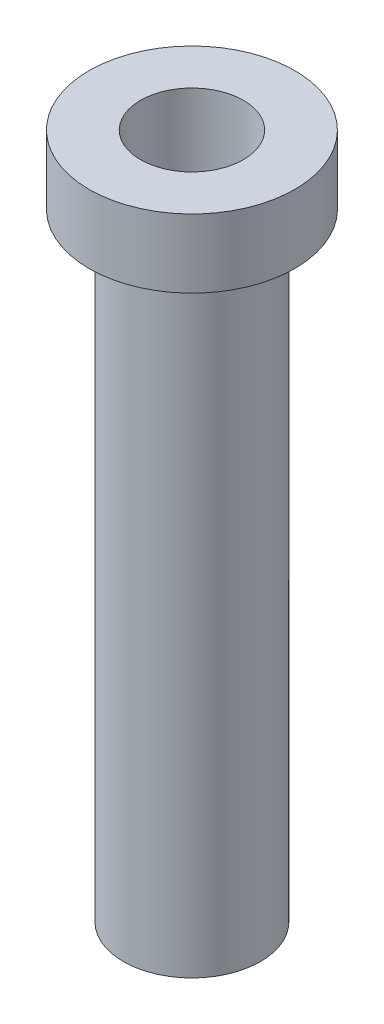
ISO-10303-21;
HEADER;
FILE_DESCRIPTION(('STEP AP214'),'2;1');
FILE_NAME('part.step','',(''),(''),'','','');
FILE_SCHEMA(('AUTOMOTIVE_DESIGN { 1 0 10303 214 1 1 1 1 }'));
ENDSEC;
DATA;
#1=APPLICATION_CONTEXT('core data for automotive mechanical design processes');
#2=APPLICATION_PROTOCOL_DEFINITION('international standard','automotive_design',2000,#1);
#3=PRODUCT_CONTEXT('',#1,'mechanical');
#4=PRODUCT('Part','Part','',(#3));
#5=PRODUCT_RELATED_PRODUCT_CATEGORY('part','',(#4));
#6=PRODUCT_DEFINITION_FORMATION('','',#4);
#7=PRODUCT_DEFINITION_CONTEXT('part definition',#1,'design');
#8=PRODUCT_DEFINITION('design','',#6,#7);
#9=PRODUCT_DEFINITION_SHAPE('','',#8);
#10=(LENGTH_UNIT() NAMED_UNIT(*) SI_UNIT(.MILLI.,.METRE.));
#11=(NAMED_UNIT(*) PLANE_ANGLE_UNIT() SI_UNIT($,.RADIAN.));
#12=(NAMED_UNIT(*) SI_UNIT($,.STERADIAN.) SOLID_ANGLE_UNIT());
#13=UNCERTAINTY_MEASURE_WITH_UNIT(LENGTH_MEASURE(1.E-05),#10,'distance_accuracy_value','');
#14=(GEOMETRIC_REPRESENTATION_CONTEXT(3) GLOBAL_UNCERTAINTY_ASSIGNED_CONTEXT((#13)) GLOBAL_UNIT_ASSIGNED_CONTEXT((#10,
#11,#12)) REPRESENTATION_CONTEXT('',''));
#15=CARTESIAN_POINT('',(0.,0.,0.));
#16=DIRECTION('',(0.,0.,1.));
#17=DIRECTION('',(1.,0.,0.));
#18=AXIS2_PLACEMENT_3D('',#15,#16,#17);
#19=CARTESIAN_POINT('',(0.,100.,0.));
#20=DIRECTION('',(0.,-1.,0.));
#21=DIRECTION('',(0.,0.,-1.));
#22=AXIS2_PLACEMENT_3D('',#19,#20,#21);
#23=CYLINDRICAL_SURFACE('',#22,10.);
#24=CARTESIAN_POINT('',(0.,0.,0.));
#25=DIRECTION('',(0.,1.,0.));
#26=DIRECTION('',(0.,0.,1.));
#27=AXIS2_PLACEMENT_3D('',#24,#25,#26);
#28=CIRCLE('',#27,10.);
#29=CARTESIAN_POINT('',(0.,0.,-10.));
#30=VERTEX_POINT('',#29);
#31=EDGE_CURVE('E47',#30,#30,#28,.T.);
#32=CARTESIAN_POINT('',(0.,90.,0.));
#33=DIRECTION('',(0.,1.,0.));
#34=DIRECTION('',(0.,0.,1.));
#35=AXIS2_PLACEMENT_3D('',#32,#33,#34);
#36=CIRCLE('',#35,10.);
#37=CARTESIAN_POINT('',(0.,90.,-10.));
#38=VERTEX_POINT('',#37);
#39=EDGE_CURVE('E10',#38,#38,#36,.T.);
#40=CARTESIAN_POINT('',(0.,0.,-10.));
#41=CARTESIAN_POINT('',(0.,0.9375,-10.));
#42=CARTESIAN_POINT('',(0.,1.875,-10.));
#43=CARTESIAN_POINT('',(0.,3.75,-10.));
#44=CARTESIAN_POINT('',(0.,4.6875,-10.));
#45=CARTESIAN_POINT('',(0.,6.5625,-10.));
#46=CARTESIAN_POINT('',(0.,7.5,-10.));
#47=CARTESIAN_POINT('',(0.,9.375,-10.));
#48=CARTESIAN_POINT('',(0.,10.3125,-10.));
#49=CARTESIAN_POINT('',(0.,12.1875,-10.));
#50=CARTESIAN_POINT('',(0.,13.125,-10.));
#51=CARTESIAN_POINT('',(0.,15.,-10.));
#52=CARTESIAN_POINT('',(0.,15.9375,-10.));
#53=CARTESIAN_POINT('',(0.,17.8125,-10.));
#54=CARTESIAN_POINT('',(0.,18.75,-10.));
#55=CARTESIAN_POINT('',(0.,20.625,-10.));
#56=CARTESIAN_POINT('',(0.,21.5625,-10.));
#57=CARTESIAN_POINT('',(0.,23.4375,-10.));
#58=CARTESIAN_POINT('',(0.,24.375,-10.));
#59=CARTESIAN_POINT('',(0.,26.25,-10.));
#60=CARTESIAN_POINT('',(0.,27.1875,-10.));
#61=CARTESIAN_POINT('',(0.,29.0625,-10.));
#62=CARTESIAN_POINT('',(0.,30.,-10.));
#63=CARTESIAN_POINT('',(0.,31.875,-10.));
#64=CARTESIAN_POINT('',(0.,32.8125,-10.));
#65=CARTESIAN_POINT('',(0.,34.6875,-10.));
#66=CARTESIAN_POINT('',(0.,35.625,-10.));
#67=CARTESIAN_POINT('',(0.,37.5,-10.));
#68=CARTESIAN_POINT('',(0.,38.4375,-10.));
#69=CARTESIAN_POINT('',(0.,40.3125,-10.));
#70=CARTESIAN_POINT('',(0.,41.25,-10.));
#71=CARTESIAN_POINT('',(0.,43.125,-10.));
#72=CARTESIAN_POINT('',(0.,44.0625,-10.));
#73=CARTESIAN_POINT('',(0.,45.9375,-10.));
#74=CARTESIAN_POINT('',(0.,46.875,-10.));
#75=CARTESIAN_POINT('',(0.,48.75,-10.));
#76=CARTESIAN_POINT('',(0.,49.6875,-10.));
#77=CARTESIAN_POINT('',(0.,51.5625,-10.));
#78=CARTESIAN_POINT('',(0.,52.5,-10.));
#79=CARTESIAN_POINT('',(0.,54.375,-10.));
#80=CARTESIAN_POINT('',(0.,55.3125,-10.));
#81=CARTESIAN_POINT('',(0.,57.1875,-10.));
#82=CARTESIAN_POINT('',(0.,58.125,-10.));
#83=CARTESIAN_POINT('',(0.,60.,-10.));
#84=CARTESIAN_POINT('',(0.,60.9375,-10.));
#85=CARTESIAN_POINT('',(0.,62.8125,-10.));
#86=CARTESIAN_POINT('',(0.,63.75,-10.));
#87=CARTESIAN_POINT('',(0.,65.625,-10.));
#88=CARTESIAN_POINT('',(0.,66.5625,-10.));
#89=CARTESIAN_POINT('',(0.,68.4375,-10.));
#90=CARTESIAN_POINT('',(0.,69.375,-10.));
#91=CARTESIAN_POINT('',(0.,71.25,-10.));
#92=CARTESIAN_POINT('',(0.,72.1875,-10.));
#93=CARTESIAN_POINT('',(0.,74.0625,-10.));
#94=CARTESIAN_POINT('',(0.,75.,-10.));
#95=CARTESIAN_POINT('',(0.,76.875,-10.));
#96=CARTESIAN_POINT('',(0.,77.8125,-10.));
#97=CARTESIAN_POINT('',(0.,79.6875,-10.));
#98=CARTESIAN_POINT('',(0.,80.625,-10.));
#99=CARTESIAN_POINT('',(0.,82.5,-10.));
#100=CARTESIAN_POINT('',(0.,83.4375,-10.));
#101=CARTESIAN_POINT('',(0.,85.3125,-10.));
#102=CARTESIAN_POINT('',(0.,86.25,-10.));
#103=CARTESIAN_POINT('',(0.,88.125,-10.));
#104=CARTESIAN_POINT('',(0.,89.0625,-10.));
#105=CARTESIAN_POINT('',(0.,90.,-10.));
#106=B_SPLINE_CURVE_WITH_KNOTS('',3,(#40,#41,#42,#43,#44,#45,#46,#47,#48,#49,#50,#51,#52,#53,
#54,#55,#56,#57,#58,#59,#60,#61,#62,#63,#64,#65,#66,#67,#68,#69,#70,#71,#72,#73,#74,#75,#76,#77,
#78,#79,#80,#81,#82,#83,#84,#85,#86,#87,#88,#89,#90,#91,#92,#93,#94,#95,#96,#97,#98,#99,#100,
#101,#102,#103,#104,#105),.UNSPECIFIED.,.F.,.F.,(4,2,2,2,2,2,2,2,2,2,2,2,2,2,2,2,2,2,2,2,2,2,2,
2,2,2,2,2,2,2,2,2,4),(0.,2.8125,5.62500000000001,8.4375,11.25,14.0625,16.875,19.6875,22.5,
25.3125,28.125,30.9375,33.75,36.5625,39.375,42.1875,45.,47.8125,50.625,53.4375,56.25,59.0625,
61.875,64.6875,67.5,70.3125,73.125,75.9375,78.75,81.5625,84.375,87.1875,90.),.UNSPECIFIED.);
#107=EDGE_CURVE('BSEAM41',#30,#38,#106,.T.);
#108=ORIENTED_EDGE('',*,*,#31,.T.);
#109=ORIENTED_EDGE('',*,*,#39,.F.);
#110=ORIENTED_EDGE('',*,*,#107,.T.);
#111=ORIENTED_EDGE('',*,*,#107,.F.);
#112=EDGE_LOOP('',(#108,#110,#109,#111));
#113=FACE_BOUND('',#112,.T.);
#114=ADVANCED_FACE('F41',(#113),#23,.T.);
#115=CARTESIAN_POINT('',(0.,100.,0.));
#116=DIRECTION('',(0.,1.,0.));
#117=DIRECTION('',(0.,0.,1.));
#118=AXIS2_PLACEMENT_3D('',#115,#116,#117);
#119=PLANE('',#118);
#120=CARTESIAN_POINT('',(0.,100.,0.));
#121=DIRECTION('',(0.,1.,0.));
#122=DIRECTION('',(0.,0.,1.));
#123=AXIS2_PLACEMENT_3D('',#120,#121,#122);
#124=CIRCLE('',#123,7.5);
#125=CARTESIAN_POINT('',(0.,100.,-7.5));
#126=VERTEX_POINT('',#125);
#127=EDGE_CURVE('E51',#126,#126,#124,.T.);
#128=ORIENTED_EDGE('',*,*,#127,.F.);
#129=EDGE_LOOP('',(#128));
#130=FACE_BOUND('',#129,.T.);
#131=CARTESIAN_POINT('',(0.,100.,0.));
#132=DIRECTION('',(0.,1.,0.));
#133=DIRECTION('',(0.,0.,1.));
#134=AXIS2_PLACEMENT_3D('',#131,#132,#133);
#135=CIRCLE('',#134,15.);
#136=CARTESIAN_POINT('',(0.,100.,15.));
#137=VERTEX_POINT('',#136);
#138=EDGE_CURVE('E61',#137,#137,#135,.T.);
#139=ORIENTED_EDGE('',*,*,#138,.T.);
#140=EDGE_LOOP('',(#139));
#141=FACE_BOUND('',#140,.T.);
#142=ADVANCED_FACE('F79',(#130,#141),#119,.T.);
#143=CARTESIAN_POINT('',(0.,0.,0.));
#144=DIRECTION('',(0.,1.,0.));
#145=DIRECTION('',(0.,0.,1.));
#146=AXIS2_PLACEMENT_3D('',#143,#144,#145);
#147=PLANE('',#146);
#148=ORIENTED_EDGE('',*,*,#31,.F.);
#149=EDGE_LOOP('',(#148));
#150=FACE_BOUND('',#149,.T.);
#151=CARTESIAN_POINT('',(0.,0.,0.));
#152=DIRECTION('',(0.,1.,0.));
#153=DIRECTION('',(0.,0.,1.));
#154=AXIS2_PLACEMENT_3D('',#151,#152,#153);
#155=CIRCLE('',#154,7.5);
#156=CARTESIAN_POINT('',(0.,0.,-7.5));
#157=VERTEX_POINT('',#156);
#158=EDGE_CURVE('E55',#157,#157,#155,.T.);
#159=ORIENTED_EDGE('',*,*,#158,.T.);
#160=EDGE_LOOP('',(#159));
#161=FACE_BOUND('',#160,.T.);
#162=ADVANCED_FACE('F83',(#150,#161),#147,.F.);
#163=CARTESIAN_POINT('',(0.,100.,0.));
#164=DIRECTION('',(0.,-1.,0.));
#165=DIRECTION('',(0.,0.,-1.));
#166=AXIS2_PLACEMENT_3D('',#163,#164,#165);
#167=CYLINDRICAL_SURFACE('',#166,7.5);
#168=CARTESIAN_POINT('',(0.,100.,-7.5));
#169=CARTESIAN_POINT('',(0.,98.9583333333333,-7.5));
#170=CARTESIAN_POINT('',(0.,97.9166666666667,-7.5));
#171=CARTESIAN_POINT('',(0.,95.8333333333333,-7.5));
#172=CARTESIAN_POINT('',(0.,94.7916666666666,-7.5));
#173=CARTESIAN_POINT('',(0.,92.7083333333333,-7.5));
#174=CARTESIAN_POINT('',(0.,91.6666666666666,-7.5));
#175=CARTESIAN_POINT('',(0.,89.5833333333333,-7.5));
#176=CARTESIAN_POINT('',(0.,88.5416666666667,-7.5));
#177=CARTESIAN_POINT('',(0.,86.4583333333333,-7.5));
#178=CARTESIAN_POINT('',(0.,85.4166666666667,-7.5));
#179=CARTESIAN_POINT('',(0.,83.3333333333333,-7.5));
#180=CARTESIAN_POINT('',(0.,82.2916666666667,-7.5));
#181=CARTESIAN_POINT('',(0.,80.2083333333333,-7.5));
#182=CARTESIAN_POINT('',(0.,79.1666666666666,-7.5));
#183=CARTESIAN_POINT('',(0.,77.0833333333333,-7.5));
#184=CARTESIAN_POINT('',(0.,76.0416666666666,-7.5));
#185=CARTESIAN_POINT('',(0.,73.9583333333333,-7.5));
#186=CARTESIAN_POINT('',(0.,72.9166666666667,-7.5));
#187=CARTESIAN_POINT('',(0.,70.8333333333333,-7.5));
#188=CARTESIAN_POINT('',(0.,69.7916666666667,-7.5));
#189=CARTESIAN_POINT('',(0.,67.7083333333333,-7.5));
#190=CARTESIAN_POINT('',(0.,66.6666666666667,-7.5));
#191=CARTESIAN_POINT('',(0.,64.5833333333333,-7.5));
#192=CARTESIAN_POINT('',(0.,63.5416666666667,-7.5));
#193=CARTESIAN_POINT('',(0.,61.4583333333333,-7.5));
#194=CARTESIAN_POINT('',(0.,60.4166666666667,-7.5));
#195=CARTESIAN_POINT('',(0.,58.3333333333333,-7.5));
#196=CARTESIAN_POINT('',(0.,57.2916666666667,-7.5));
#197=CARTESIAN_POINT('',(0.,55.2083333333333,-7.5));
#198=CARTESIAN_POINT('',(0.,54.1666666666667,-7.5));
#199=CARTESIAN_POINT('',(0.,52.0833333333333,-7.5));
#200=CARTESIAN_POINT('',(0.,51.0416666666667,-7.5));
#201=CARTESIAN_POINT('',(0.,48.9583333333333,-7.5));
#202=CARTESIAN_POINT('',(0.,47.9166666666667,-7.5));
#203=CARTESIAN_POINT('',(0.,45.8333333333333,-7.5));
#204=CARTESIAN_POINT('',(0.,44.7916666666667,-7.5));
#205=CARTESIAN_POINT('',(0.,42.7083333333333,-7.5));
#206=CARTESIAN_POINT('',(0.,41.6666666666667,-7.5));
#207=CARTESIAN_POINT('',(0.,39.5833333333333,-7.5));
#208=CARTESIAN_POINT('',(0.,38.5416666666667,-7.5));
#209=CARTESIAN_POINT('',(0.,36.4583333333333,-7.5));
#210=CARTESIAN_POINT('',(0.,35.4166666666667,-7.5));
#211=CARTESIAN_POINT('',(0.,33.3333333333333,-7.5));
#212=CARTESIAN_POINT('',(0.,32.2916666666667,-7.5));
#213=CARTESIAN_POINT('',(0.,30.2083333333333,-7.5));
#214=CARTESIAN_POINT('',(0.,29.1666666666667,-7.5));
#215=CARTESIAN_POINT('',(0.,27.0833333333333,-7.5));
#216=CARTESIAN_POINT('',(0.,26.0416666666667,-7.5));
#217=CARTESIAN_POINT('',(0.,23.9583333333333,-7.5));
#218=CARTESIAN_POINT('',(0.,22.9166666666667,-7.5));
#219=CARTESIAN_POINT('',(0.,20.8333333333333,-7.5));
#220=CARTESIAN_POINT('',(0.,19.7916666666667,-7.5));
#221=CARTESIAN_POINT('',(0.,17.7083333333333,-7.5));
#222=CARTESIAN_POINT('',(0.,16.6666666666667,-7.5));
#223=CARTESIAN_POINT('',(0.,14.5833333333333,-7.5));
#224=CARTESIAN_POINT('',(0.,13.5416666666667,-7.5));
#225=CARTESIAN_POINT('',(0.,11.4583333333333,-7.5));
#226=CARTESIAN_POINT('',(0.,10.4166666666667,-7.5));
#227=CARTESIAN_POINT('',(0.,8.33333333333333,-7.5));
#228=CARTESIAN_POINT('',(0.,7.29166666666667,-7.5));
#229=CARTESIAN_POINT('',(0.,5.20833333333334,-7.5));
#230=CARTESIAN_POINT('',(0.,4.16666666666667,-7.5));
#231=CARTESIAN_POINT('',(0.,2.08333333333334,-7.5));
#232=CARTESIAN_POINT('',(0.,1.04166666666667,-7.5));
#233=CARTESIAN_POINT('',(0.,0.,-7.5));
#234=B_SPLINE_CURVE_WITH_KNOTS('',3,(#168,#169,#170,#171,#172,#173,#174,#175,#176,#177,#178,
#179,#180,#181,#182,#183,#184,#185,#186,#187,#188,#189,#190,#191,#192,#193,#194,#195,#196,#197,
#198,#199,#200,#201,#202,#203,#204,#205,#206,#207,#208,#209,#210,#211,#212,#213,#214,#215,#216,
#217,#218,#219,#220,#221,#222,#223,#224,#225,#226,#227,#228,#229,#230,#231,#232,#233),
.UNSPECIFIED.,.F.,.F.,(4,2,2,2,2,2,2,2,2,2,2,2,2,2,2,2,2,2,2,2,2,2,2,2,2,2,2,2,2,2,2,2,4),(0.,
3.12499999999999,6.24999999999999,9.37499999999999,12.5,15.625,18.75,21.875,25.,28.125,31.25,
34.375,37.5,40.625,43.75,46.875,50.,53.125,56.25,59.375,62.5,65.625,68.75,71.875,75.,78.125,
81.25,84.375,87.5,90.625,93.75,96.875,100.),.UNSPECIFIED.);
#235=EDGE_CURVE('BSEAM76',#126,#157,#234,.T.);
#236=ORIENTED_EDGE('',*,*,#127,.T.);
#237=ORIENTED_EDGE('',*,*,#158,.F.);
#238=ORIENTED_EDGE('',*,*,#235,.T.);
#239=ORIENTED_EDGE('',*,*,#235,.F.);
#240=EDGE_LOOP('',(#236,#238,#237,#239));
#241=FACE_BOUND('',#240,.T.);
#242=ADVANCED_FACE('F76',(#241),#167,.F.);
#243=CARTESIAN_POINT('',(0.,90.,0.));
#244=DIRECTION('',(0.,1.,0.));
#245=DIRECTION('',(0.,0.,1.));
#246=AXIS2_PLACEMENT_3D('',#243,#244,#245);
#247=CYLINDRICAL_SURFACE('',#246,15.);
#248=CARTESIAN_POINT('',(0.,90.,0.));
#249=DIRECTION('',(0.,1.,0.));
#250=DIRECTION('',(0.,0.,1.));
#251=AXIS2_PLACEMENT_3D('',#248,#249,#250);
#252=CIRCLE('',#251,15.);
#253=CARTESIAN_POINT('',(0.,90.,15.));
#254=VERTEX_POINT('',#253);
#255=EDGE_CURVE('E59',#254,#254,#252,.T.);
#256=ORIENTED_EDGE('',*,*,#255,.T.);
#257=EDGE_LOOP('',(#256));
#258=FACE_BOUND('',#257,.T.);
#259=ORIENTED_EDGE('',*,*,#138,.F.);
#260=EDGE_LOOP('',(#259));
#261=FACE_BOUND('',#260,.T.);
#262=ADVANCED_FACE('F67',(#258,#261),#247,.T.);
#263=CARTESIAN_POINT('',(0.,90.,0.));
#264=DIRECTION('',(0.,1.,0.));
#265=DIRECTION('',(0.,0.,1.));
#266=AXIS2_PLACEMENT_3D('',#263,#264,#265);
#267=PLANE('',#266);
#268=ORIENTED_EDGE('',*,*,#39,.T.);
#269=EDGE_LOOP('',(#268));
#270=FACE_BOUND('',#269,.T.);
#271=ORIENTED_EDGE('',*,*,#255,.F.);
#272=EDGE_LOOP('',(#271));
#273=FACE_BOUND('',#272,.T.);
#274=ADVANCED_FACE('F70',(#270,#273),#267,.F.);
#275=CLOSED_SHELL('',(#114,#142,#162,#242,#262,#274));
#276=MANIFOLD_SOLID_BREP('B2',#275);
#277=ADVANCED_BREP_SHAPE_REPRESENTATION('',(#18,#276),#14);
#278=SHAPE_DEFINITION_REPRESENTATION(#9,#277);
ENDSEC;
END-ISO-10303-21;
